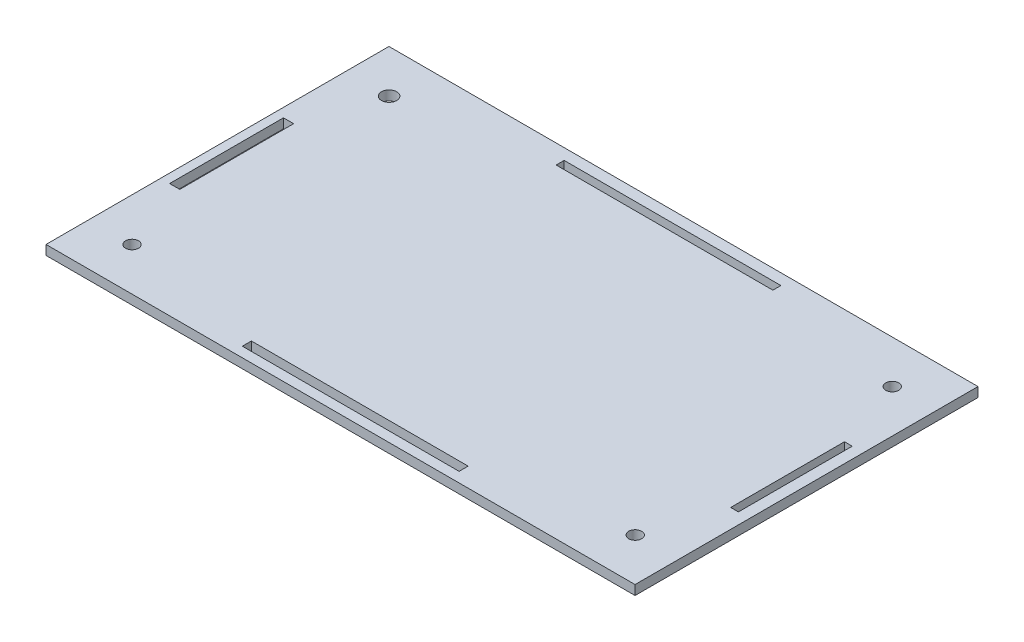
ISO-10303-21;
HEADER;
FILE_DESCRIPTION(('STEP AP214'),'2;1');
FILE_NAME('part.step','',(''),(''),'','','');
FILE_SCHEMA(('AUTOMOTIVE_DESIGN { 1 0 10303 214 1 1 1 1 }'));
ENDSEC;
DATA;
#1=APPLICATION_CONTEXT('core data for automotive mechanical design processes');
#2=APPLICATION_PROTOCOL_DEFINITION('international standard','automotive_design',2000,#1);
#3=PRODUCT_CONTEXT('',#1,'mechanical');
#4=PRODUCT('Part','Part','',(#3));
#5=PRODUCT_RELATED_PRODUCT_CATEGORY('part','',(#4));
#6=PRODUCT_DEFINITION_FORMATION('','',#4);
#7=PRODUCT_DEFINITION_CONTEXT('part definition',#1,'design');
#8=PRODUCT_DEFINITION('design','',#6,#7);
#9=PRODUCT_DEFINITION_SHAPE('','',#8);
#10=(LENGTH_UNIT() NAMED_UNIT(*) SI_UNIT(.MILLI.,.METRE.));
#11=(NAMED_UNIT(*) PLANE_ANGLE_UNIT() SI_UNIT($,.RADIAN.));
#12=(NAMED_UNIT(*) SI_UNIT($,.STERADIAN.) SOLID_ANGLE_UNIT());
#13=UNCERTAINTY_MEASURE_WITH_UNIT(LENGTH_MEASURE(1.E-05),#10,'distance_accuracy_value','');
#14=(GEOMETRIC_REPRESENTATION_CONTEXT(3) GLOBAL_UNCERTAINTY_ASSIGNED_CONTEXT((#13)) GLOBAL_UNIT_ASSIGNED_CONTEXT((#10,
#11,#12)) REPRESENTATION_CONTEXT('',''));
#15=CARTESIAN_POINT('',(0.,0.,0.));
#16=DIRECTION('',(0.,0.,1.));
#17=DIRECTION('',(1.,0.,0.));
#18=AXIS2_PLACEMENT_3D('',#15,#16,#17);
#19=CARTESIAN_POINT('',(0.,2.,0.));
#20=DIRECTION('',(0.,1.,0.));
#21=DIRECTION('',(0.,0.,1.));
#22=AXIS2_PLACEMENT_3D('',#19,#20,#21);
#23=PLANE('',#22);
#24=CARTESIAN_POINT('',(3.77654316969848,2.,-57.6261227740658));
#25=DIRECTION('',(0.,1.,0.));
#26=DIRECTION('',(0.,0.,1.));
#27=AXIS2_PLACEMENT_3D('',#24,#25,#26);
#28=CIRCLE('',#27,1.6);
#29=CARTESIAN_POINT('',(3.77654316969848,2.,-56.0261227740658));
#30=VERTEX_POINT('',#29);
#31=EDGE_CURVE('E275',#30,#30,#28,.T.);
#32=ORIENTED_EDGE('',*,*,#31,.F.);
#33=EDGE_LOOP('',(#32));
#34=FACE_BOUND('',#33,.T.);
#35=CARTESIAN_POINT('',(3.77654316969848,2.,-3.77812277406583));
#36=DIRECTION('',(0.,1.,0.));
#37=DIRECTION('',(0.,0.,1.));
#38=AXIS2_PLACEMENT_3D('',#35,#36,#37);
#39=CIRCLE('',#38,1.36090461119174);
#40=CARTESIAN_POINT('',(3.77654316969848,2.,-2.41721816287409));
#41=VERTEX_POINT('',#40);
#42=EDGE_CURVE('E287',#41,#41,#39,.T.);
#43=ORIENTED_EDGE('',*,*,#42,.F.);
#44=EDGE_LOOP('',(#43));
#45=FACE_BOUND('',#44,.T.);
#46=DIRECTION('',(0.,0.,1.));
#47=VECTOR('',#46,1.);
#48=CARTESIAN_POINT('',(-5.25404766131645,2.,-66.6261227740658));
#49=LINE('',#48,#47);
#50=CARTESIAN_POINT('',(-5.25404766131645,2.,-66.6261227740658));
#51=VERTEX_POINT('',#50);
#52=CARTESIAN_POINT('',(-5.25404766131644,2.,5.22187722593417));
#53=VERTEX_POINT('',#52);
#54=EDGE_CURVE('E324',#51,#53,#49,.T.);
#55=ORIENTED_EDGE('',*,*,#54,.T.);
#56=DIRECTION('',(1.,0.,0.));
#57=VECTOR('',#56,1.);
#58=CARTESIAN_POINT('',(-5.25404766131644,2.,5.22187722593417));
#59=LINE('',#58,#57);
#60=CARTESIAN_POINT('',(118.155952338684,2.,5.22187722593417));
#61=VERTEX_POINT('',#60);
#62=EDGE_CURVE('E327',#53,#61,#59,.T.);
#63=ORIENTED_EDGE('',*,*,#62,.T.);
#64=DIRECTION('',(0.,0.,-1.));
#65=VECTOR('',#64,1.);
#66=CARTESIAN_POINT('',(118.155952338684,2.,-66.6261227740658));
#67=LINE('',#66,#65);
#68=CARTESIAN_POINT('',(118.155952338684,2.,-66.6261227740658));
#69=VERTEX_POINT('',#68);
#70=EDGE_CURVE('E330',#61,#69,#67,.T.);
#71=ORIENTED_EDGE('',*,*,#70,.T.);
#72=DIRECTION('',(-1.,0.,0.));
#73=VECTOR('',#72,1.);
#74=CARTESIAN_POINT('',(-5.25404766131645,2.,-66.6261227740658));
#75=LINE('',#74,#73);
#76=EDGE_CURVE('E332',#69,#51,#75,.T.);
#77=ORIENTED_EDGE('',*,*,#76,.T.);
#78=EDGE_LOOP('',(#55,#63,#71,#77));
#79=FACE_BOUND('',#78,.T.);
#80=DIRECTION('',(-1.,0.,0.));
#81=VECTOR('',#80,1.);
#82=CARTESIAN_POINT('',(-1.22345683030151,2.,-42.6261227740658));
#83=LINE('',#82,#81);
#84=CARTESIAN_POINT('',(-1.22345683030151,2.,-42.6261227740658));
#85=VERTEX_POINT('',#84);
#86=CARTESIAN_POINT('',(-3.35581404538697,2.,-42.6261227740658));
#87=VERTEX_POINT('',#86);
#88=EDGE_CURVE('E295',#85,#87,#83,.T.);
#89=ORIENTED_EDGE('',*,*,#88,.F.);
#90=DIRECTION('',(0.,0.,-1.));
#91=VECTOR('',#90,1.);
#92=CARTESIAN_POINT('',(-1.22345683030151,2.,-42.6261227740658));
#93=LINE('',#92,#91);
#94=CARTESIAN_POINT('',(-1.22345683030151,2.,-18.7781227740658));
#95=VERTEX_POINT('',#94);
#96=EDGE_CURVE('E293',#95,#85,#93,.T.);
#97=ORIENTED_EDGE('',*,*,#96,.F.);
#98=DIRECTION('',(1.,0.,0.));
#99=VECTOR('',#98,1.);
#100=CARTESIAN_POINT('',(-1.22345683030151,2.,-18.7781227740658));
#101=LINE('',#100,#99);
#102=CARTESIAN_POINT('',(-3.35581404538696,2.,-18.7781227740658));
#103=VERTEX_POINT('',#102);
#104=EDGE_CURVE('E301',#103,#95,#101,.T.);
#105=ORIENTED_EDGE('',*,*,#104,.F.);
#106=DIRECTION('',(0.,0.,1.));
#107=VECTOR('',#106,1.);
#108=CARTESIAN_POINT('',(-3.35581404538697,2.,-42.6261227740658));
#109=LINE('',#108,#107);
#110=EDGE_CURVE('E298',#87,#103,#109,.T.);
#111=ORIENTED_EDGE('',*,*,#110,.F.);
#112=EDGE_LOOP('',(#89,#97,#105,#111));
#113=FACE_BOUND('',#112,.T.);
#114=CARTESIAN_POINT('',(109.186543169698,2.,-3.77812277406583));
#115=DIRECTION('',(0.,1.,0.));
#116=DIRECTION('',(0.,0.,1.));
#117=AXIS2_PLACEMENT_3D('',#114,#115,#116);
#118=CIRCLE('',#117,1.36090461119174);
#119=CARTESIAN_POINT('',(109.186543169698,2.,-2.41721816287408));
#120=VERTEX_POINT('',#119);
#121=EDGE_CURVE('E281',#120,#120,#118,.T.);
#122=ORIENTED_EDGE('',*,*,#121,.F.);
#123=EDGE_LOOP('',(#122));
#124=FACE_BOUND('',#123,.T.);
#125=CARTESIAN_POINT('',(109.186543169698,2.,-57.6261227740658));
#126=DIRECTION('',(0.,1.,0.));
#127=DIRECTION('',(0.,0.,1.));
#128=AXIS2_PLACEMENT_3D('',#125,#126,#127);
#129=CIRCLE('',#128,1.36090461119174);
#130=CARTESIAN_POINT('',(109.186543169698,2.,-56.2652181628741));
#131=VERTEX_POINT('',#130);
#132=EDGE_CURVE('E269',#131,#131,#129,.T.);
#133=ORIENTED_EDGE('',*,*,#132,.F.);
#134=EDGE_LOOP('',(#133));
#135=FACE_BOUND('',#134,.T.);
#136=DIRECTION('',(1.,0.,0.));
#137=VECTOR('',#136,1.);
#138=CARTESIAN_POINT('',(33.7765431696985,2.,-62.6261227740658));
#139=LINE('',#138,#137);
#140=CARTESIAN_POINT('',(33.7765431696985,2.,-62.6261227740658));
#141=VERTEX_POINT('',#140);
#142=CARTESIAN_POINT('',(79.1865431696985,2.,-62.6261227740658));
#143=VERTEX_POINT('',#142);
#144=EDGE_CURVE('E240',#141,#143,#139,.T.);
#145=ORIENTED_EDGE('',*,*,#144,.F.);
#146=DIRECTION('',(0.,0.,1.));
#147=VECTOR('',#146,1.);
#148=CARTESIAN_POINT('',(33.7765431696985,2.,-62.6261227740658));
#149=LINE('',#148,#147);
#150=CARTESIAN_POINT('',(33.7765431696985,2.,-64.3033250212329));
#151=VERTEX_POINT('',#150);
#152=EDGE_CURVE('E238',#151,#141,#149,.T.);
#153=ORIENTED_EDGE('',*,*,#152,.F.);
#154=DIRECTION('',(-1.,0.,0.));
#155=VECTOR('',#154,1.);
#156=CARTESIAN_POINT('',(33.7765431696985,2.,-64.3033250212329));
#157=LINE('',#156,#155);
#158=CARTESIAN_POINT('',(79.1865431696985,2.,-64.3033250212329));
#159=VERTEX_POINT('',#158);
#160=EDGE_CURVE('E246',#159,#151,#157,.T.);
#161=ORIENTED_EDGE('',*,*,#160,.F.);
#162=DIRECTION('',(0.,0.,-1.));
#163=VECTOR('',#162,1.);
#164=CARTESIAN_POINT('',(79.1865431696985,2.,-62.6261227740658));
#165=LINE('',#164,#163);
#166=EDGE_CURVE('E243',#143,#159,#165,.T.);
#167=ORIENTED_EDGE('',*,*,#166,.F.);
#168=EDGE_LOOP('',(#145,#153,#161,#167));
#169=FACE_BOUND('',#168,.T.);
#170=DIRECTION('',(1.,0.,0.));
#171=VECTOR('',#170,1.);
#172=CARTESIAN_POINT('',(114.186543169698,2.,-18.7781227740658));
#173=LINE('',#172,#171);
#174=CARTESIAN_POINT('',(114.186543169698,2.,-18.7781227740658));
#175=VERTEX_POINT('',#174);
#176=CARTESIAN_POINT('',(115.807328384207,2.,-18.7781227740658));
#177=VERTEX_POINT('',#176);
#178=EDGE_CURVE('E209',#175,#177,#173,.T.);
#179=ORIENTED_EDGE('',*,*,#178,.F.);
#180=DIRECTION('',(0.,0.,1.));
#181=VECTOR('',#180,1.);
#182=CARTESIAN_POINT('',(114.186543169698,2.,-42.6261227740658));
#183=LINE('',#182,#181);
#184=CARTESIAN_POINT('',(114.186543169698,2.,-42.6261227740658));
#185=VERTEX_POINT('',#184);
#186=EDGE_CURVE('E207',#185,#175,#183,.T.);
#187=ORIENTED_EDGE('',*,*,#186,.F.);
#188=DIRECTION('',(-1.,0.,0.));
#189=VECTOR('',#188,1.);
#190=CARTESIAN_POINT('',(114.186543169698,2.,-42.6261227740658));
#191=LINE('',#190,#189);
#192=CARTESIAN_POINT('',(115.807328384207,2.,-42.6261227740658));
#193=VERTEX_POINT('',#192);
#194=EDGE_CURVE('E215',#193,#185,#191,.T.);
#195=ORIENTED_EDGE('',*,*,#194,.F.);
#196=DIRECTION('',(0.,0.,-1.));
#197=VECTOR('',#196,1.);
#198=CARTESIAN_POINT('',(115.807328384207,2.,-42.6261227740658));
#199=LINE('',#198,#197);
#200=EDGE_CURVE('E212',#177,#193,#199,.T.);
#201=ORIENTED_EDGE('',*,*,#200,.F.);
#202=EDGE_LOOP('',(#179,#187,#195,#201));
#203=FACE_BOUND('',#202,.T.);
#204=DIRECTION('',(-1.,0.,0.));
#205=VECTOR('',#204,1.);
#206=CARTESIAN_POINT('',(79.1865431696985,2.,1.22187722593417));
#207=LINE('',#206,#205);
#208=CARTESIAN_POINT('',(79.1865431696985,2.,1.22187722593417));
#209=VERTEX_POINT('',#208);
#210=CARTESIAN_POINT('',(33.7765431696985,2.,1.22187722593417));
#211=VERTEX_POINT('',#210);
#212=EDGE_CURVE('E179',#209,#211,#207,.T.);
#213=ORIENTED_EDGE('',*,*,#212,.F.);
#214=DIRECTION('',(0.,0.,-1.));
#215=VECTOR('',#214,1.);
#216=CARTESIAN_POINT('',(79.1865431696985,2.,1.22187722593417));
#217=LINE('',#216,#215);
#218=CARTESIAN_POINT('',(79.1865431696985,2.,3.11465326356853));
#219=VERTEX_POINT('',#218);
#220=EDGE_CURVE('E171',#219,#209,#217,.T.);
#221=ORIENTED_EDGE('',*,*,#220,.F.);
#222=DIRECTION('',(1.,0.,0.));
#223=VECTOR('',#222,1.);
#224=CARTESIAN_POINT('',(79.1865431696985,2.,3.11465326356853));
#225=LINE('',#224,#223);
#226=CARTESIAN_POINT('',(33.7765431696985,2.,3.11465326356853));
#227=VERTEX_POINT('',#226);
#228=EDGE_CURVE('E193',#227,#219,#225,.T.);
#229=ORIENTED_EDGE('',*,*,#228,.F.);
#230=DIRECTION('',(0.,0.,1.));
#231=VECTOR('',#230,1.);
#232=CARTESIAN_POINT('',(33.7765431696985,2.,1.22187722593417));
#233=LINE('',#232,#231);
#234=EDGE_CURVE('E191',#211,#227,#233,.T.);
#235=ORIENTED_EDGE('',*,*,#234,.F.);
#236=EDGE_LOOP('',(#213,#221,#229,#235));
#237=FACE_BOUND('',#236,.T.);
#238=ADVANCED_FACE('F34',(#34,#45,#79,#113,#124,#135,#169,#203,#237),#23,.T.);
#239=CARTESIAN_POINT('',(0.,0.,0.));
#240=DIRECTION('',(0.,1.,0.));
#241=DIRECTION('',(0.,0.,1.));
#242=AXIS2_PLACEMENT_3D('',#239,#240,#241);
#243=PLANE('',#242);
#244=DIRECTION('',(0.,0.,1.));
#245=VECTOR('',#244,1.);
#246=CARTESIAN_POINT('',(114.186543169698,0.,-42.6261227740658));
#247=LINE('',#246,#245);
#248=CARTESIAN_POINT('',(114.186543169698,0.,-42.6261227740658));
#249=VERTEX_POINT('',#248);
#250=CARTESIAN_POINT('',(114.186543169698,0.,-18.7781227740658));
#251=VERTEX_POINT('',#250);
#252=EDGE_CURVE('E187',#249,#251,#247,.T.);
#253=ORIENTED_EDGE('',*,*,#252,.T.);
#254=DIRECTION('',(1.,0.,0.));
#255=VECTOR('',#254,1.);
#256=CARTESIAN_POINT('',(114.186543169698,0.,-18.7781227740658));
#257=LINE('',#256,#255);
#258=CARTESIAN_POINT('',(115.807328384207,0.,-18.7781227740658));
#259=VERTEX_POINT('',#258);
#260=EDGE_CURVE('E220',#251,#259,#257,.T.);
#261=ORIENTED_EDGE('',*,*,#260,.T.);
#262=DIRECTION('',(0.,0.,-1.));
#263=VECTOR('',#262,1.);
#264=CARTESIAN_POINT('',(115.807328384207,0.,-42.6261227740658));
#265=LINE('',#264,#263);
#266=CARTESIAN_POINT('',(115.807328384207,0.,-42.6261227740658));
#267=VERTEX_POINT('',#266);
#268=EDGE_CURVE('E223',#259,#267,#265,.T.);
#269=ORIENTED_EDGE('',*,*,#268,.T.);
#270=DIRECTION('',(-1.,0.,0.));
#271=VECTOR('',#270,1.);
#272=CARTESIAN_POINT('',(114.186543169698,0.,-42.6261227740658));
#273=LINE('',#272,#271);
#274=EDGE_CURVE('E210',#267,#249,#273,.T.);
#275=ORIENTED_EDGE('',*,*,#274,.T.);
#276=EDGE_LOOP('',(#253,#261,#269,#275));
#277=FACE_BOUND('',#276,.T.);
#278=CARTESIAN_POINT('',(109.186543169698,0.,-57.6261227740658));
#279=DIRECTION('',(0.,1.,0.));
#280=DIRECTION('',(0.,0.,1.));
#281=AXIS2_PLACEMENT_3D('',#278,#279,#280);
#282=CIRCLE('',#281,1.36090461119174);
#283=CARTESIAN_POINT('',(109.186543169698,0.,-56.2652181628741));
#284=VERTEX_POINT('',#283);
#285=EDGE_CURVE('E268',#284,#284,#282,.T.);
#286=ORIENTED_EDGE('',*,*,#285,.T.);
#287=EDGE_LOOP('',(#286));
#288=FACE_BOUND('',#287,.T.);
#289=CARTESIAN_POINT('',(3.77654316969848,0.,-57.6261227740658));
#290=DIRECTION('',(0.,1.,0.));
#291=DIRECTION('',(0.,0.,1.));
#292=AXIS2_PLACEMENT_3D('',#289,#290,#291);
#293=CIRCLE('',#292,1.6);
#294=CARTESIAN_POINT('',(3.77654316969848,0.,-56.0261227740658));
#295=VERTEX_POINT('',#294);
#296=EDGE_CURVE('E272',#295,#295,#293,.T.);
#297=ORIENTED_EDGE('',*,*,#296,.T.);
#298=EDGE_LOOP('',(#297));
#299=FACE_BOUND('',#298,.T.);
#300=CARTESIAN_POINT('',(109.186543169698,0.,-3.77812277406583));
#301=DIRECTION('',(0.,1.,0.));
#302=DIRECTION('',(0.,0.,1.));
#303=AXIS2_PLACEMENT_3D('',#300,#301,#302);
#304=CIRCLE('',#303,1.36090461119174);
#305=CARTESIAN_POINT('',(109.186543169698,0.,-2.41721816287408));
#306=VERTEX_POINT('',#305);
#307=EDGE_CURVE('E278',#306,#306,#304,.T.);
#308=ORIENTED_EDGE('',*,*,#307,.T.);
#309=EDGE_LOOP('',(#308));
#310=FACE_BOUND('',#309,.T.);
#311=CARTESIAN_POINT('',(3.77654316969848,0.,-3.77812277406583));
#312=DIRECTION('',(0.,1.,0.));
#313=DIRECTION('',(0.,0.,1.));
#314=AXIS2_PLACEMENT_3D('',#311,#312,#313);
#315=CIRCLE('',#314,1.36090461119174);
#316=CARTESIAN_POINT('',(3.77654316969848,0.,-2.41721816287409));
#317=VERTEX_POINT('',#316);
#318=EDGE_CURVE('E284',#317,#317,#315,.T.);
#319=ORIENTED_EDGE('',*,*,#318,.T.);
#320=EDGE_LOOP('',(#319));
#321=FACE_BOUND('',#320,.T.);
#322=DIRECTION('',(0.,0.,-1.));
#323=VECTOR('',#322,1.);
#324=CARTESIAN_POINT('',(-1.22345683030151,0.,-42.6261227740658));
#325=LINE('',#324,#323);
#326=CARTESIAN_POINT('',(-1.22345683030151,0.,-18.7781227740658));
#327=VERTEX_POINT('',#326);
#328=CARTESIAN_POINT('',(-1.22345683030151,0.,-42.6261227740658));
#329=VERTEX_POINT('',#328);
#330=EDGE_CURVE('E290',#327,#329,#325,.T.);
#331=ORIENTED_EDGE('',*,*,#330,.T.);
#332=DIRECTION('',(-1.,0.,0.));
#333=VECTOR('',#332,1.);
#334=CARTESIAN_POINT('',(-1.22345683030151,0.,-42.6261227740658));
#335=LINE('',#334,#333);
#336=CARTESIAN_POINT('',(-3.35581404538697,0.,-42.6261227740658));
#337=VERTEX_POINT('',#336);
#338=EDGE_CURVE('E306',#329,#337,#335,.T.);
#339=ORIENTED_EDGE('',*,*,#338,.T.);
#340=DIRECTION('',(0.,0.,1.));
#341=VECTOR('',#340,1.);
#342=CARTESIAN_POINT('',(-3.35581404538697,0.,-42.6261227740658));
#343=LINE('',#342,#341);
#344=CARTESIAN_POINT('',(-3.35581404538696,0.,-18.7781227740658));
#345=VERTEX_POINT('',#344);
#346=EDGE_CURVE('E309',#337,#345,#343,.T.);
#347=ORIENTED_EDGE('',*,*,#346,.T.);
#348=DIRECTION('',(1.,0.,0.));
#349=VECTOR('',#348,1.);
#350=CARTESIAN_POINT('',(-1.22345683030151,0.,-18.7781227740658));
#351=LINE('',#350,#349);
#352=EDGE_CURVE('E296',#345,#327,#351,.T.);
#353=ORIENTED_EDGE('',*,*,#352,.T.);
#354=EDGE_LOOP('',(#331,#339,#347,#353));
#355=FACE_BOUND('',#354,.T.);
#356=DIRECTION('',(0.,0.,1.));
#357=VECTOR('',#356,1.);
#358=CARTESIAN_POINT('',(-5.25404766131645,0.,-66.6261227740658));
#359=LINE('',#358,#357);
#360=CARTESIAN_POINT('',(-5.25404766131645,0.,-66.6261227740658));
#361=VERTEX_POINT('',#360);
#362=CARTESIAN_POINT('',(-5.25404766131644,0.,5.22187722593417));
#363=VERTEX_POINT('',#362);
#364=EDGE_CURVE('E323',#361,#363,#359,.T.);
#365=ORIENTED_EDGE('',*,*,#364,.F.);
#366=DIRECTION('',(-1.,0.,0.));
#367=VECTOR('',#366,1.);
#368=CARTESIAN_POINT('',(-5.25404766131645,0.,-66.6261227740658));
#369=LINE('',#368,#367);
#370=CARTESIAN_POINT('',(118.155952338684,0.,-66.6261227740658));
#371=VERTEX_POINT('',#370);
#372=EDGE_CURVE('E328',#371,#361,#369,.T.);
#373=ORIENTED_EDGE('',*,*,#372,.F.);
#374=DIRECTION('',(0.,0.,-1.));
#375=VECTOR('',#374,1.);
#376=CARTESIAN_POINT('',(118.155952338684,0.,-66.6261227740658));
#377=LINE('',#376,#375);
#378=CARTESIAN_POINT('',(118.155952338684,0.,5.22187722593417));
#379=VERTEX_POINT('',#378);
#380=EDGE_CURVE('E339',#379,#371,#377,.T.);
#381=ORIENTED_EDGE('',*,*,#380,.F.);
#382=DIRECTION('',(1.,0.,0.));
#383=VECTOR('',#382,1.);
#384=CARTESIAN_POINT('',(-5.25404766131644,0.,5.22187722593417));
#385=LINE('',#384,#383);
#386=EDGE_CURVE('E337',#363,#379,#385,.T.);
#387=ORIENTED_EDGE('',*,*,#386,.F.);
#388=EDGE_LOOP('',(#365,#373,#381,#387));
#389=FACE_BOUND('',#388,.T.);
#390=DIRECTION('',(0.,0.,1.));
#391=VECTOR('',#390,1.);
#392=CARTESIAN_POINT('',(33.7765431696985,0.,-62.6261227740658));
#393=LINE('',#392,#391);
#394=CARTESIAN_POINT('',(33.7765431696985,0.,-64.3033250212329));
#395=VERTEX_POINT('',#394);
#396=CARTESIAN_POINT('',(33.7765431696985,0.,-62.6261227740658));
#397=VERTEX_POINT('',#396);
#398=EDGE_CURVE('E237',#395,#397,#393,.T.);
#399=ORIENTED_EDGE('',*,*,#398,.T.);
#400=DIRECTION('',(1.,0.,0.));
#401=VECTOR('',#400,1.);
#402=CARTESIAN_POINT('',(33.7765431696985,0.,-62.6261227740658));
#403=LINE('',#402,#401);
#404=CARTESIAN_POINT('',(79.1865431696985,0.,-62.6261227740658));
#405=VERTEX_POINT('',#404);
#406=EDGE_CURVE('E251',#397,#405,#403,.T.);
#407=ORIENTED_EDGE('',*,*,#406,.T.);
#408=DIRECTION('',(0.,0.,-1.));
#409=VECTOR('',#408,1.);
#410=CARTESIAN_POINT('',(79.1865431696985,0.,-62.6261227740658));
#411=LINE('',#410,#409);
#412=CARTESIAN_POINT('',(79.1865431696985,0.,-64.3033250212329));
#413=VERTEX_POINT('',#412);
#414=EDGE_CURVE('E254',#405,#413,#411,.T.);
#415=ORIENTED_EDGE('',*,*,#414,.T.);
#416=DIRECTION('',(-1.,0.,0.));
#417=VECTOR('',#416,1.);
#418=CARTESIAN_POINT('',(33.7765431696985,0.,-64.3033250212329));
#419=LINE('',#418,#417);
#420=EDGE_CURVE('E241',#413,#395,#419,.T.);
#421=ORIENTED_EDGE('',*,*,#420,.T.);
#422=EDGE_LOOP('',(#399,#407,#415,#421));
#423=FACE_BOUND('',#422,.T.);
#424=DIRECTION('',(0.,0.,-1.));
#425=VECTOR('',#424,1.);
#426=CARTESIAN_POINT('',(79.1865431696985,0.,1.22187722593417));
#427=LINE('',#426,#425);
#428=CARTESIAN_POINT('',(79.1865431696985,0.,3.11465326356853));
#429=VERTEX_POINT('',#428);
#430=CARTESIAN_POINT('',(79.1865431696985,0.,1.22187722593417));
#431=VERTEX_POINT('',#430);
#432=EDGE_CURVE('E57',#429,#431,#427,.T.);
#433=ORIENTED_EDGE('',*,*,#432,.T.);
#434=DIRECTION('',(-1.,0.,0.));
#435=VECTOR('',#434,1.);
#436=CARTESIAN_POINT('',(79.1865431696985,0.,1.22187722593417));
#437=LINE('',#436,#435);
#438=CARTESIAN_POINT('',(33.7765431696985,0.,1.22187722593417));
#439=VERTEX_POINT('',#438);
#440=EDGE_CURVE('E186',#431,#439,#437,.T.);
#441=ORIENTED_EDGE('',*,*,#440,.T.);
#442=DIRECTION('',(0.,0.,1.));
#443=VECTOR('',#442,1.);
#444=CARTESIAN_POINT('',(33.7765431696985,0.,1.22187722593417));
#445=LINE('',#444,#443);
#446=CARTESIAN_POINT('',(33.7765431696985,0.,3.11465326356853));
#447=VERTEX_POINT('',#446);
#448=EDGE_CURVE('E199',#439,#447,#445,.T.);
#449=ORIENTED_EDGE('',*,*,#448,.T.);
#450=DIRECTION('',(1.,0.,0.));
#451=VECTOR('',#450,1.);
#452=CARTESIAN_POINT('',(79.1865431696985,0.,3.11465326356853));
#453=LINE('',#452,#451);
#454=EDGE_CURVE('E180',#447,#429,#453,.T.);
#455=ORIENTED_EDGE('',*,*,#454,.T.);
#456=EDGE_LOOP('',(#433,#441,#449,#455));
#457=FACE_BOUND('',#456,.T.);
#458=ADVANCED_FACE('F357',(#277,#288,#299,#310,#321,#355,#389,#423,#457),#243,.F.);
#459=CARTESIAN_POINT('',(-5.25404766131645,2.,-66.6261227740658));
#460=DIRECTION('',(1.,0.,0.));
#461=DIRECTION('',(0.,0.,-1.));
#462=AXIS2_PLACEMENT_3D('',#459,#460,#461);
#463=PLANE('',#462);
#464=ORIENTED_EDGE('',*,*,#364,.T.);
#465=DIRECTION('',(0.,-1.,0.));
#466=VECTOR('',#465,1.);
#467=CARTESIAN_POINT('',(-5.25404766131644,2.,5.22187722593417));
#468=LINE('',#467,#466);
#469=EDGE_CURVE('E11',#53,#363,#468,.T.);
#470=ORIENTED_EDGE('',*,*,#469,.F.);
#471=ORIENTED_EDGE('',*,*,#54,.F.);
#472=DIRECTION('',(0.,-1.,0.));
#473=VECTOR('',#472,1.);
#474=CARTESIAN_POINT('',(-5.25404766131645,2.,-66.6261227740658));
#475=LINE('',#474,#473);
#476=EDGE_CURVE('E334',#51,#361,#475,.T.);
#477=ORIENTED_EDGE('',*,*,#476,.T.);
#478=EDGE_LOOP('',(#464,#470,#471,#477));
#479=FACE_BOUND('',#478,.T.);
#480=ADVANCED_FACE('F36',(#479),#463,.F.);
#481=CARTESIAN_POINT('',(-5.25404766131644,2.,5.22187722593417));
#482=DIRECTION('',(0.,0.,-1.));
#483=DIRECTION('',(-1.,0.,0.));
#484=AXIS2_PLACEMENT_3D('',#481,#482,#483);
#485=PLANE('',#484);
#486=ORIENTED_EDGE('',*,*,#386,.T.);
#487=DIRECTION('',(0.,-1.,0.));
#488=VECTOR('',#487,1.);
#489=CARTESIAN_POINT('',(118.155952338684,2.,5.22187722593417));
#490=LINE('',#489,#488);
#491=EDGE_CURVE('E42',#61,#379,#490,.T.);
#492=ORIENTED_EDGE('',*,*,#491,.F.);
#493=ORIENTED_EDGE('',*,*,#62,.F.);
#494=ORIENTED_EDGE('',*,*,#469,.T.);
#495=EDGE_LOOP('',(#486,#492,#493,#494));
#496=FACE_BOUND('',#495,.T.);
#497=ADVANCED_FACE('F368',(#496),#485,.F.);
#498=CARTESIAN_POINT('',(118.155952338684,2.,-66.6261227740658));
#499=DIRECTION('',(-1.,0.,0.));
#500=DIRECTION('',(0.,0.,1.));
#501=AXIS2_PLACEMENT_3D('',#498,#499,#500);
#502=PLANE('',#501);
#503=ORIENTED_EDGE('',*,*,#380,.T.);
#504=DIRECTION('',(0.,-1.,0.));
#505=VECTOR('',#504,1.);
#506=CARTESIAN_POINT('',(118.155952338684,2.,-66.6261227740658));
#507=LINE('',#506,#505);
#508=EDGE_CURVE('E344',#69,#371,#507,.T.);
#509=ORIENTED_EDGE('',*,*,#508,.F.);
#510=ORIENTED_EDGE('',*,*,#70,.F.);
#511=ORIENTED_EDGE('',*,*,#491,.T.);
#512=EDGE_LOOP('',(#503,#509,#510,#511));
#513=FACE_BOUND('',#512,.T.);
#514=ADVANCED_FACE('F351',(#513),#502,.F.);
#515=CARTESIAN_POINT('',(-5.25404766131645,2.,-66.6261227740658));
#516=DIRECTION('',(0.,0.,1.));
#517=DIRECTION('',(1.,0.,0.));
#518=AXIS2_PLACEMENT_3D('',#515,#516,#517);
#519=PLANE('',#518);
#520=ORIENTED_EDGE('',*,*,#372,.T.);
#521=ORIENTED_EDGE('',*,*,#476,.F.);
#522=ORIENTED_EDGE('',*,*,#76,.F.);
#523=ORIENTED_EDGE('',*,*,#508,.T.);
#524=EDGE_LOOP('',(#520,#521,#522,#523));
#525=FACE_BOUND('',#524,.T.);
#526=ADVANCED_FACE('F361',(#525),#519,.F.);
#527=CARTESIAN_POINT('',(-1.22345683030151,2.,-42.6261227740658));
#528=DIRECTION('',(-1.,0.,0.));
#529=DIRECTION('',(0.,0.,1.));
#530=AXIS2_PLACEMENT_3D('',#527,#528,#529);
#531=PLANE('',#530);
#532=ORIENTED_EDGE('',*,*,#330,.F.);
#533=DIRECTION('',(0.,-1.,0.));
#534=VECTOR('',#533,1.);
#535=CARTESIAN_POINT('',(-1.22345683030151,2.,-18.7781227740658));
#536=LINE('',#535,#534);
#537=EDGE_CURVE('E303',#95,#327,#536,.T.);
#538=ORIENTED_EDGE('',*,*,#537,.F.);
#539=ORIENTED_EDGE('',*,*,#96,.T.);
#540=DIRECTION('',(0.,-1.,0.));
#541=VECTOR('',#540,1.);
#542=CARTESIAN_POINT('',(-1.22345683030151,2.,-42.6261227740658));
#543=LINE('',#542,#541);
#544=EDGE_CURVE('E320',#85,#329,#543,.T.);
#545=ORIENTED_EDGE('',*,*,#544,.T.);
#546=EDGE_LOOP('',(#532,#538,#539,#545));
#547=FACE_BOUND('',#546,.T.);
#548=ADVANCED_FACE('F386',(#547),#531,.T.);
#549=CARTESIAN_POINT('',(-1.22345683030151,2.,-42.6261227740658));
#550=DIRECTION('',(0.,0.,1.));
#551=DIRECTION('',(1.,0.,0.));
#552=AXIS2_PLACEMENT_3D('',#549,#550,#551);
#553=PLANE('',#552);
#554=ORIENTED_EDGE('',*,*,#338,.F.);
#555=ORIENTED_EDGE('',*,*,#544,.F.);
#556=ORIENTED_EDGE('',*,*,#88,.T.);
#557=DIRECTION('',(0.,-1.,0.));
#558=VECTOR('',#557,1.);
#559=CARTESIAN_POINT('',(-3.35581404538697,2.,-42.6261227740658));
#560=LINE('',#559,#558);
#561=EDGE_CURVE('E318',#87,#337,#560,.T.);
#562=ORIENTED_EDGE('',*,*,#561,.T.);
#563=EDGE_LOOP('',(#554,#555,#556,#562));
#564=FACE_BOUND('',#563,.T.);
#565=ADVANCED_FACE('F393',(#564),#553,.T.);
#566=CARTESIAN_POINT('',(-3.35581404538697,2.,-42.6261227740658));
#567=DIRECTION('',(1.,0.,0.));
#568=DIRECTION('',(0.,0.,-1.));
#569=AXIS2_PLACEMENT_3D('',#566,#567,#568);
#570=PLANE('',#569);
#571=ORIENTED_EDGE('',*,*,#346,.F.);
#572=ORIENTED_EDGE('',*,*,#561,.F.);
#573=ORIENTED_EDGE('',*,*,#110,.T.);
#574=DIRECTION('',(0.,-1.,0.));
#575=VECTOR('',#574,1.);
#576=CARTESIAN_POINT('',(-3.35581404538696,2.,-18.7781227740658));
#577=LINE('',#576,#575);
#578=EDGE_CURVE('E316',#103,#345,#577,.T.);
#579=ORIENTED_EDGE('',*,*,#578,.T.);
#580=EDGE_LOOP('',(#571,#572,#573,#579));
#581=FACE_BOUND('',#580,.T.);
#582=ADVANCED_FACE('F398',(#581),#570,.T.);
#583=CARTESIAN_POINT('',(-1.22345683030151,2.,-18.7781227740658));
#584=DIRECTION('',(0.,0.,-1.));
#585=DIRECTION('',(-1.,0.,0.));
#586=AXIS2_PLACEMENT_3D('',#583,#584,#585);
#587=PLANE('',#586);
#588=ORIENTED_EDGE('',*,*,#352,.F.);
#589=ORIENTED_EDGE('',*,*,#578,.F.);
#590=ORIENTED_EDGE('',*,*,#104,.T.);
#591=ORIENTED_EDGE('',*,*,#537,.T.);
#592=EDGE_LOOP('',(#588,#589,#590,#591));
#593=FACE_BOUND('',#592,.T.);
#594=ADVANCED_FACE('F406',(#593),#587,.T.);
#595=CARTESIAN_POINT('',(3.77654316969848,2.,-3.77812277406583));
#596=DIRECTION('',(0.,-1.,0.));
#597=DIRECTION('',(0.,0.,-1.));
#598=AXIS2_PLACEMENT_3D('',#595,#596,#597);
#599=CYLINDRICAL_SURFACE('',#598,1.36090461119174);
#600=ORIENTED_EDGE('',*,*,#42,.T.);
#601=EDGE_LOOP('',(#600));
#602=FACE_BOUND('',#601,.T.);
#603=ORIENTED_EDGE('',*,*,#318,.F.);
#604=EDGE_LOOP('',(#603));
#605=FACE_BOUND('',#604,.T.);
#606=ADVANCED_FACE('F481',(#602,#605),#599,.F.);
#607=CARTESIAN_POINT('',(109.186543169698,2.,-3.77812277406583));
#608=DIRECTION('',(0.,-1.,0.));
#609=DIRECTION('',(0.,0.,-1.));
#610=AXIS2_PLACEMENT_3D('',#607,#608,#609);
#611=CYLINDRICAL_SURFACE('',#610,1.36090461119174);
#612=ORIENTED_EDGE('',*,*,#121,.T.);
#613=EDGE_LOOP('',(#612));
#614=FACE_BOUND('',#613,.T.);
#615=ORIENTED_EDGE('',*,*,#307,.F.);
#616=EDGE_LOOP('',(#615));
#617=FACE_BOUND('',#616,.T.);
#618=ADVANCED_FACE('F477',(#614,#617),#611,.F.);
#619=CARTESIAN_POINT('',(3.77654316969848,2.,-57.6261227740658));
#620=DIRECTION('',(0.,-1.,0.));
#621=DIRECTION('',(0.,0.,-1.));
#622=AXIS2_PLACEMENT_3D('',#619,#620,#621);
#623=CYLINDRICAL_SURFACE('',#622,1.6);
#624=ORIENTED_EDGE('',*,*,#31,.T.);
#625=EDGE_LOOP('',(#624));
#626=FACE_BOUND('',#625,.T.);
#627=ORIENTED_EDGE('',*,*,#296,.F.);
#628=EDGE_LOOP('',(#627));
#629=FACE_BOUND('',#628,.T.);
#630=ADVANCED_FACE('F473',(#626,#629),#623,.F.);
#631=CARTESIAN_POINT('',(109.186543169698,2.,-57.6261227740658));
#632=DIRECTION('',(0.,-1.,0.));
#633=DIRECTION('',(0.,0.,-1.));
#634=AXIS2_PLACEMENT_3D('',#631,#632,#633);
#635=CYLINDRICAL_SURFACE('',#634,1.36090461119174);
#636=ORIENTED_EDGE('',*,*,#132,.T.);
#637=EDGE_LOOP('',(#636));
#638=FACE_BOUND('',#637,.T.);
#639=ORIENTED_EDGE('',*,*,#285,.F.);
#640=EDGE_LOOP('',(#639));
#641=FACE_BOUND('',#640,.T.);
#642=ADVANCED_FACE('F469',(#638,#641),#635,.F.);
#643=CARTESIAN_POINT('',(33.7765431696985,2.,-62.6261227740658));
#644=DIRECTION('',(1.,0.,0.));
#645=DIRECTION('',(0.,0.,-1.));
#646=AXIS2_PLACEMENT_3D('',#643,#644,#645);
#647=PLANE('',#646);
#648=ORIENTED_EDGE('',*,*,#398,.F.);
#649=DIRECTION('',(0.,-1.,0.));
#650=VECTOR('',#649,1.);
#651=CARTESIAN_POINT('',(33.7765431696985,2.,-64.3033250212329));
#652=LINE('',#651,#650);
#653=EDGE_CURVE('E248',#151,#395,#652,.T.);
#654=ORIENTED_EDGE('',*,*,#653,.F.);
#655=ORIENTED_EDGE('',*,*,#152,.T.);
#656=DIRECTION('',(0.,-1.,0.));
#657=VECTOR('',#656,1.);
#658=CARTESIAN_POINT('',(33.7765431696985,2.,-62.6261227740658));
#659=LINE('',#658,#657);
#660=EDGE_CURVE('E265',#141,#397,#659,.T.);
#661=ORIENTED_EDGE('',*,*,#660,.T.);
#662=EDGE_LOOP('',(#648,#654,#655,#661));
#663=FACE_BOUND('',#662,.T.);
#664=ADVANCED_FACE('F465',(#663),#647,.T.);
#665=CARTESIAN_POINT('',(33.7765431696985,2.,-62.6261227740658));
#666=DIRECTION('',(0.,0.,-1.));
#667=DIRECTION('',(-1.,0.,0.));
#668=AXIS2_PLACEMENT_3D('',#665,#666,#667);
#669=PLANE('',#668);
#670=ORIENTED_EDGE('',*,*,#406,.F.);
#671=ORIENTED_EDGE('',*,*,#660,.F.);
#672=ORIENTED_EDGE('',*,*,#144,.T.);
#673=DIRECTION('',(0.,-1.,0.));
#674=VECTOR('',#673,1.);
#675=CARTESIAN_POINT('',(79.1865431696985,2.,-62.6261227740658));
#676=LINE('',#675,#674);
#677=EDGE_CURVE('E263',#143,#405,#676,.T.);
#678=ORIENTED_EDGE('',*,*,#677,.T.);
#679=EDGE_LOOP('',(#670,#671,#672,#678));
#680=FACE_BOUND('',#679,.T.);
#681=ADVANCED_FACE('F461',(#680),#669,.T.);
#682=CARTESIAN_POINT('',(79.1865431696985,2.,-62.6261227740658));
#683=DIRECTION('',(-1.,0.,0.));
#684=DIRECTION('',(0.,0.,1.));
#685=AXIS2_PLACEMENT_3D('',#682,#683,#684);
#686=PLANE('',#685);
#687=ORIENTED_EDGE('',*,*,#414,.F.);
#688=ORIENTED_EDGE('',*,*,#677,.F.);
#689=ORIENTED_EDGE('',*,*,#166,.T.);
#690=DIRECTION('',(0.,-1.,0.));
#691=VECTOR('',#690,1.);
#692=CARTESIAN_POINT('',(79.1865431696985,2.,-64.3033250212329));
#693=LINE('',#692,#691);
#694=EDGE_CURVE('E261',#159,#413,#693,.T.);
#695=ORIENTED_EDGE('',*,*,#694,.T.);
#696=EDGE_LOOP('',(#687,#688,#689,#695));
#697=FACE_BOUND('',#696,.T.);
#698=ADVANCED_FACE('F457',(#697),#686,.T.);
#699=CARTESIAN_POINT('',(33.7765431696985,2.,-64.3033250212329));
#700=DIRECTION('',(0.,0.,1.));
#701=DIRECTION('',(1.,0.,0.));
#702=AXIS2_PLACEMENT_3D('',#699,#700,#701);
#703=PLANE('',#702);
#704=ORIENTED_EDGE('',*,*,#420,.F.);
#705=ORIENTED_EDGE('',*,*,#694,.F.);
#706=ORIENTED_EDGE('',*,*,#160,.T.);
#707=ORIENTED_EDGE('',*,*,#653,.T.);
#708=EDGE_LOOP('',(#704,#705,#706,#707));
#709=FACE_BOUND('',#708,.T.);
#710=ADVANCED_FACE('F454',(#709),#703,.T.);
#711=CARTESIAN_POINT('',(114.186543169698,2.,-42.6261227740658));
#712=DIRECTION('',(1.,0.,0.));
#713=DIRECTION('',(0.,0.,-1.));
#714=AXIS2_PLACEMENT_3D('',#711,#712,#713);
#715=PLANE('',#714);
#716=ORIENTED_EDGE('',*,*,#252,.F.);
#717=DIRECTION('',(0.,-1.,0.));
#718=VECTOR('',#717,1.);
#719=CARTESIAN_POINT('',(114.186543169698,2.,-42.6261227740658));
#720=LINE('',#719,#718);
#721=EDGE_CURVE('E217',#185,#249,#720,.T.);
#722=ORIENTED_EDGE('',*,*,#721,.F.);
#723=ORIENTED_EDGE('',*,*,#186,.T.);
#724=DIRECTION('',(0.,-1.,0.));
#725=VECTOR('',#724,1.);
#726=CARTESIAN_POINT('',(114.186543169698,2.,-18.7781227740658));
#727=LINE('',#726,#725);
#728=EDGE_CURVE('E234',#175,#251,#727,.T.);
#729=ORIENTED_EDGE('',*,*,#728,.T.);
#730=EDGE_LOOP('',(#716,#722,#723,#729));
#731=FACE_BOUND('',#730,.T.);
#732=ADVANCED_FACE('F436',(#731),#715,.T.);
#733=CARTESIAN_POINT('',(114.186543169698,2.,-18.7781227740658));
#734=DIRECTION('',(0.,0.,-1.));
#735=DIRECTION('',(-1.,0.,0.));
#736=AXIS2_PLACEMENT_3D('',#733,#734,#735);
#737=PLANE('',#736);
#738=ORIENTED_EDGE('',*,*,#260,.F.);
#739=ORIENTED_EDGE('',*,*,#728,.F.);
#740=ORIENTED_EDGE('',*,*,#178,.T.);
#741=DIRECTION('',(0.,-1.,0.));
#742=VECTOR('',#741,1.);
#743=CARTESIAN_POINT('',(115.807328384207,2.,-18.7781227740658));
#744=LINE('',#743,#742);
#745=EDGE_CURVE('E232',#177,#259,#744,.T.);
#746=ORIENTED_EDGE('',*,*,#745,.T.);
#747=EDGE_LOOP('',(#738,#739,#740,#746));
#748=FACE_BOUND('',#747,.T.);
#749=ADVANCED_FACE('F429',(#748),#737,.T.);
#750=CARTESIAN_POINT('',(115.807328384207,2.,-42.6261227740658));
#751=DIRECTION('',(-1.,0.,0.));
#752=DIRECTION('',(0.,0.,1.));
#753=AXIS2_PLACEMENT_3D('',#750,#751,#752);
#754=PLANE('',#753);
#755=ORIENTED_EDGE('',*,*,#268,.F.);
#756=ORIENTED_EDGE('',*,*,#745,.F.);
#757=ORIENTED_EDGE('',*,*,#200,.T.);
#758=DIRECTION('',(0.,-1.,0.));
#759=VECTOR('',#758,1.);
#760=CARTESIAN_POINT('',(115.807328384207,2.,-42.6261227740658));
#761=LINE('',#760,#759);
#762=EDGE_CURVE('E230',#193,#267,#761,.T.);
#763=ORIENTED_EDGE('',*,*,#762,.T.);
#764=EDGE_LOOP('',(#755,#756,#757,#763));
#765=FACE_BOUND('',#764,.T.);
#766=ADVANCED_FACE('F432',(#765),#754,.T.);
#767=CARTESIAN_POINT('',(114.186543169698,2.,-42.6261227740658));
#768=DIRECTION('',(0.,0.,1.));
#769=DIRECTION('',(1.,0.,0.));
#770=AXIS2_PLACEMENT_3D('',#767,#768,#769);
#771=PLANE('',#770);
#772=ORIENTED_EDGE('',*,*,#274,.F.);
#773=ORIENTED_EDGE('',*,*,#762,.F.);
#774=ORIENTED_EDGE('',*,*,#194,.T.);
#775=ORIENTED_EDGE('',*,*,#721,.T.);
#776=EDGE_LOOP('',(#772,#773,#774,#775));
#777=FACE_BOUND('',#776,.T.);
#778=ADVANCED_FACE('F439',(#777),#771,.T.);
#779=CARTESIAN_POINT('',(79.1865431696985,2.,1.22187722593417));
#780=DIRECTION('',(-1.,0.,0.));
#781=DIRECTION('',(0.,0.,1.));
#782=AXIS2_PLACEMENT_3D('',#779,#780,#781);
#783=PLANE('',#782);
#784=ORIENTED_EDGE('',*,*,#432,.F.);
#785=DIRECTION('',(0.,-1.,0.));
#786=VECTOR('',#785,1.);
#787=CARTESIAN_POINT('',(79.1865431696985,2.,3.11465326356853));
#788=LINE('',#787,#786);
#789=EDGE_CURVE('E175',#219,#429,#788,.T.);
#790=ORIENTED_EDGE('',*,*,#789,.F.);
#791=ORIENTED_EDGE('',*,*,#220,.T.);
#792=DIRECTION('',(0.,-1.,0.));
#793=VECTOR('',#792,1.);
#794=CARTESIAN_POINT('',(79.1865431696985,2.,1.22187722593417));
#795=LINE('',#794,#793);
#796=EDGE_CURVE('E174',#209,#431,#795,.T.);
#797=ORIENTED_EDGE('',*,*,#796,.T.);
#798=EDGE_LOOP('',(#784,#790,#791,#797));
#799=FACE_BOUND('',#798,.T.);
#800=ADVANCED_FACE('F173',(#799),#783,.T.);
#801=CARTESIAN_POINT('',(79.1865431696985,2.,1.22187722593417));
#802=DIRECTION('',(0.,0.,1.));
#803=DIRECTION('',(1.,0.,0.));
#804=AXIS2_PLACEMENT_3D('',#801,#802,#803);
#805=PLANE('',#804);
#806=ORIENTED_EDGE('',*,*,#440,.F.);
#807=ORIENTED_EDGE('',*,*,#796,.F.);
#808=ORIENTED_EDGE('',*,*,#212,.T.);
#809=DIRECTION('',(0.,-1.,0.));
#810=VECTOR('',#809,1.);
#811=CARTESIAN_POINT('',(33.7765431696985,2.,1.22187722593417));
#812=LINE('',#811,#810);
#813=EDGE_CURVE('E188',#211,#439,#812,.T.);
#814=ORIENTED_EDGE('',*,*,#813,.T.);
#815=EDGE_LOOP('',(#806,#807,#808,#814));
#816=FACE_BOUND('',#815,.T.);
#817=ADVANCED_FACE('F183',(#816),#805,.T.);
#818=CARTESIAN_POINT('',(33.7765431696985,2.,1.22187722593417));
#819=DIRECTION('',(1.,0.,0.));
#820=DIRECTION('',(0.,0.,-1.));
#821=AXIS2_PLACEMENT_3D('',#818,#819,#820);
#822=PLANE('',#821);
#823=ORIENTED_EDGE('',*,*,#448,.F.);
#824=ORIENTED_EDGE('',*,*,#813,.F.);
#825=ORIENTED_EDGE('',*,*,#234,.T.);
#826=DIRECTION('',(0.,-1.,0.));
#827=VECTOR('',#826,1.);
#828=CARTESIAN_POINT('',(33.7765431696985,2.,3.11465326356853));
#829=LINE('',#828,#827);
#830=EDGE_CURVE('E49',#227,#447,#829,.T.);
#831=ORIENTED_EDGE('',*,*,#830,.T.);
#832=EDGE_LOOP('',(#823,#824,#825,#831));
#833=FACE_BOUND('',#832,.T.);
#834=ADVANCED_FACE('F560',(#833),#822,.T.);
#835=CARTESIAN_POINT('',(79.1865431696985,2.,3.11465326356853));
#836=DIRECTION('',(0.,0.,-1.));
#837=DIRECTION('',(-1.,0.,0.));
#838=AXIS2_PLACEMENT_3D('',#835,#836,#837);
#839=PLANE('',#838);
#840=ORIENTED_EDGE('',*,*,#454,.F.);
#841=ORIENTED_EDGE('',*,*,#830,.F.);
#842=ORIENTED_EDGE('',*,*,#228,.T.);
#843=ORIENTED_EDGE('',*,*,#789,.T.);
#844=EDGE_LOOP('',(#840,#841,#842,#843));
#845=FACE_BOUND('',#844,.T.);
#846=ADVANCED_FACE('F568',(#845),#839,.T.);
#847=CLOSED_SHELL('',(#238,#458,#480,#497,#514,#526,#548,#565,#582,#594,#606,#618,#630,#642,
#664,#681,#698,#710,#732,#749,#766,#778,#800,#817,#834,#846));
#848=MANIFOLD_SOLID_BREP('B2',#847);
#849=ADVANCED_BREP_SHAPE_REPRESENTATION('',(#18,#848),#14);
#850=SHAPE_DEFINITION_REPRESENTATION(#9,#849);
ENDSEC;
END-ISO-10303-21;
